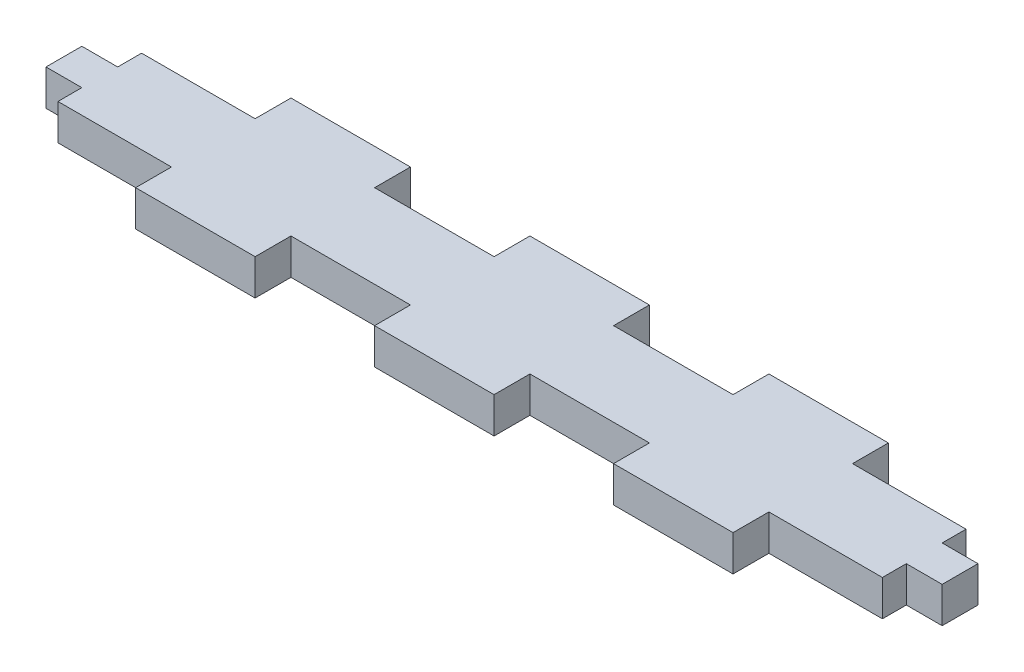
ISO-10303-21;
HEADER;
FILE_DESCRIPTION(('STEP AP214'),'2;1');
FILE_NAME('part.step','',(''),(''),'','','');
FILE_SCHEMA(('AUTOMOTIVE_DESIGN { 1 0 10303 214 1 1 1 1 }'));
ENDSEC;
DATA;
#1=APPLICATION_CONTEXT('core data for automotive mechanical design processes');
#2=APPLICATION_PROTOCOL_DEFINITION('international standard','automotive_design',2000,#1);
#3=PRODUCT_CONTEXT('',#1,'mechanical');
#4=PRODUCT('Part','Part','',(#3));
#5=PRODUCT_RELATED_PRODUCT_CATEGORY('part','',(#4));
#6=PRODUCT_DEFINITION_FORMATION('','',#4);
#7=PRODUCT_DEFINITION_CONTEXT('part definition',#1,'design');
#8=PRODUCT_DEFINITION('design','',#6,#7);
#9=PRODUCT_DEFINITION_SHAPE('','',#8);
#10=(LENGTH_UNIT() NAMED_UNIT(*) SI_UNIT(.MILLI.,.METRE.));
#11=(NAMED_UNIT(*) PLANE_ANGLE_UNIT() SI_UNIT($,.RADIAN.));
#12=(NAMED_UNIT(*) SI_UNIT($,.STERADIAN.) SOLID_ANGLE_UNIT());
#13=UNCERTAINTY_MEASURE_WITH_UNIT(LENGTH_MEASURE(1.E-05),#10,'distance_accuracy_value','');
#14=(GEOMETRIC_REPRESENTATION_CONTEXT(3) GLOBAL_UNCERTAINTY_ASSIGNED_CONTEXT((#13)) GLOBAL_UNIT_ASSIGNED_CONTEXT((#10,
#11,#12)) REPRESENTATION_CONTEXT('',''));
#15=CARTESIAN_POINT('',(0.,0.,0.));
#16=DIRECTION('',(0.,0.,1.));
#17=DIRECTION('',(1.,0.,0.));
#18=AXIS2_PLACEMENT_3D('',#15,#16,#17);
#19=CARTESIAN_POINT('',(42.5,3.,0.));
#20=DIRECTION('',(1.,0.,0.));
#21=DIRECTION('',(0.,0.,-1.));
#22=AXIS2_PLACEMENT_3D('',#19,#20,#21);
#23=PLANE('',#22);
#24=DIRECTION('',(0.,0.,1.));
#25=VECTOR('',#24,1.);
#26=CARTESIAN_POINT('',(42.5,0.,0.));
#27=LINE('',#26,#25);
#28=CARTESIAN_POINT('',(42.5,0.,-13.));
#29=VERTEX_POINT('',#28);
#30=CARTESIAN_POINT('',(42.5,0.,-9.99999999999997));
#31=VERTEX_POINT('',#30);
#32=EDGE_CURVE('E295',#29,#31,#27,.T.);
#33=ORIENTED_EDGE('',*,*,#32,.F.);
#34=DIRECTION('',(0.,-1.,0.));
#35=VECTOR('',#34,1.);
#36=CARTESIAN_POINT('',(42.5,3.,-13.));
#37=LINE('',#36,#35);
#38=CARTESIAN_POINT('',(42.5,3.,-13.));
#39=VERTEX_POINT('',#38);
#40=EDGE_CURVE('E11',#39,#29,#37,.T.);
#41=ORIENTED_EDGE('',*,*,#40,.F.);
#42=DIRECTION('',(0.,0.,1.));
#43=VECTOR('',#42,1.);
#44=CARTESIAN_POINT('',(42.5,3.,0.));
#45=LINE('',#44,#43);
#46=CARTESIAN_POINT('',(42.5,3.,-9.99999999999997));
#47=VERTEX_POINT('',#46);
#48=EDGE_CURVE('E383',#39,#47,#45,.T.);
#49=ORIENTED_EDGE('',*,*,#48,.T.);
#50=DIRECTION('',(0.,-1.,0.));
#51=VECTOR('',#50,1.);
#52=CARTESIAN_POINT('',(42.5,3.,-9.99999999999997));
#53=LINE('',#52,#51);
#54=EDGE_CURVE('E49',#47,#31,#53,.T.);
#55=ORIENTED_EDGE('',*,*,#54,.T.);
#56=EDGE_LOOP('',(#33,#41,#49,#55));
#57=FACE_BOUND('',#56,.T.);
#58=ADVANCED_FACE('F33',(#57),#23,.T.);
#59=CARTESIAN_POINT('',(0.,3.,-13.));
#60=DIRECTION('',(0.,0.,1.));
#61=DIRECTION('',(1.,0.,0.));
#62=AXIS2_PLACEMENT_3D('',#59,#60,#61);
#63=PLANE('',#62);
#64=DIRECTION('',(-1.,0.,0.));
#65=VECTOR('',#64,1.);
#66=CARTESIAN_POINT('',(0.,0.,-13.));
#67=LINE('',#66,#65);
#68=CARTESIAN_POINT('',(32.5,0.,-13.));
#69=VERTEX_POINT('',#68);
#70=EDGE_CURVE('E297',#29,#69,#67,.T.);
#71=ORIENTED_EDGE('',*,*,#70,.T.);
#72=DIRECTION('',(0.,-1.,0.));
#73=VECTOR('',#72,1.);
#74=CARTESIAN_POINT('',(32.5,3.,-13.));
#75=LINE('',#74,#73);
#76=CARTESIAN_POINT('',(32.5,3.,-13.));
#77=VERTEX_POINT('',#76);
#78=EDGE_CURVE('E41',#77,#69,#75,.T.);
#79=ORIENTED_EDGE('',*,*,#78,.F.);
#80=DIRECTION('',(-1.,0.,0.));
#81=VECTOR('',#80,1.);
#82=CARTESIAN_POINT('',(0.,3.,-13.));
#83=LINE('',#82,#81);
#84=EDGE_CURVE('E995',#39,#77,#83,.T.);
#85=ORIENTED_EDGE('',*,*,#84,.F.);
#86=ORIENTED_EDGE('',*,*,#40,.T.);
#87=EDGE_LOOP('',(#71,#79,#85,#86));
#88=FACE_BOUND('',#87,.T.);
#89=ADVANCED_FACE('F569',(#88),#63,.F.);
#90=CARTESIAN_POINT('',(32.5,3.,0.));
#91=DIRECTION('',(1.,0.,0.));
#92=DIRECTION('',(0.,0.,-1.));
#93=AXIS2_PLACEMENT_3D('',#90,#91,#92);
#94=PLANE('',#93);
#95=DIRECTION('',(0.,0.,1.));
#96=VECTOR('',#95,1.);
#97=CARTESIAN_POINT('',(32.5,0.,0.));
#98=LINE('',#97,#96);
#99=CARTESIAN_POINT('',(32.5,0.,-9.99999999999997));
#100=VERTEX_POINT('',#99);
#101=EDGE_CURVE('E299',#69,#100,#98,.T.);
#102=ORIENTED_EDGE('',*,*,#101,.T.);
#103=DIRECTION('',(0.,-1.,0.));
#104=VECTOR('',#103,1.);
#105=CARTESIAN_POINT('',(32.5,3.,-9.99999999999997));
#106=LINE('',#105,#104);
#107=CARTESIAN_POINT('',(32.5,3.,-9.99999999999997));
#108=VERTEX_POINT('',#107);
#109=EDGE_CURVE('E459',#108,#100,#106,.T.);
#110=ORIENTED_EDGE('',*,*,#109,.F.);
#111=DIRECTION('',(0.,0.,1.));
#112=VECTOR('',#111,1.);
#113=CARTESIAN_POINT('',(32.5,3.,0.));
#114=LINE('',#113,#112);
#115=EDGE_CURVE('E468',#77,#108,#114,.T.);
#116=ORIENTED_EDGE('',*,*,#115,.F.);
#117=ORIENTED_EDGE('',*,*,#78,.T.);
#118=EDGE_LOOP('',(#102,#110,#116,#117));
#119=FACE_BOUND('',#118,.T.);
#120=ADVANCED_FACE('F466',(#119),#94,.F.);
#121=CARTESIAN_POINT('',(0.,3.,-9.99999999999996));
#122=DIRECTION('',(0.,0.,1.));
#123=DIRECTION('',(1.,0.,0.));
#124=AXIS2_PLACEMENT_3D('',#121,#122,#123);
#125=PLANE('',#124);
#126=DIRECTION('',(-1.,0.,0.));
#127=VECTOR('',#126,1.);
#128=CARTESIAN_POINT('',(0.,0.,-9.99999999999996));
#129=LINE('',#128,#127);
#130=CARTESIAN_POINT('',(22.5,0.,-9.99999999999997));
#131=VERTEX_POINT('',#130);
#132=EDGE_CURVE('E301',#100,#131,#129,.T.);
#133=ORIENTED_EDGE('',*,*,#132,.T.);
#134=DIRECTION('',(0.,-1.,0.));
#135=VECTOR('',#134,1.);
#136=CARTESIAN_POINT('',(22.5,3.,-9.99999999999997));
#137=LINE('',#136,#135);
#138=CARTESIAN_POINT('',(22.5,3.,-9.99999999999997));
#139=VERTEX_POINT('',#138);
#140=EDGE_CURVE('E456',#139,#131,#137,.T.);
#141=ORIENTED_EDGE('',*,*,#140,.F.);
#142=DIRECTION('',(-1.,0.,0.));
#143=VECTOR('',#142,1.);
#144=CARTESIAN_POINT('',(0.,3.,-9.99999999999996));
#145=LINE('',#144,#143);
#146=EDGE_CURVE('E487',#108,#139,#145,.T.);
#147=ORIENTED_EDGE('',*,*,#146,.F.);
#148=ORIENTED_EDGE('',*,*,#109,.T.);
#149=EDGE_LOOP('',(#133,#141,#147,#148));
#150=FACE_BOUND('',#149,.T.);
#151=ADVANCED_FACE('F478',(#150),#125,.F.);
#152=CARTESIAN_POINT('',(22.5,3.,0.));
#153=DIRECTION('',(-1.,0.,0.));
#154=DIRECTION('',(0.,0.,1.));
#155=AXIS2_PLACEMENT_3D('',#152,#153,#154);
#156=PLANE('',#155);
#157=DIRECTION('',(0.,0.,-1.));
#158=VECTOR('',#157,1.);
#159=CARTESIAN_POINT('',(22.5,0.,0.));
#160=LINE('',#159,#158);
#161=CARTESIAN_POINT('',(22.5,0.,-13.));
#162=VERTEX_POINT('',#161);
#163=EDGE_CURVE('E303',#131,#162,#160,.T.);
#164=ORIENTED_EDGE('',*,*,#163,.T.);
#165=DIRECTION('',(0.,-1.,0.));
#166=VECTOR('',#165,1.);
#167=CARTESIAN_POINT('',(22.5,3.,-13.));
#168=LINE('',#167,#166);
#169=CARTESIAN_POINT('',(22.5,3.,-13.));
#170=VERTEX_POINT('',#169);
#171=EDGE_CURVE('E453',#170,#162,#168,.T.);
#172=ORIENTED_EDGE('',*,*,#171,.F.);
#173=DIRECTION('',(0.,0.,-1.));
#174=VECTOR('',#173,1.);
#175=CARTESIAN_POINT('',(22.5,3.,0.));
#176=LINE('',#175,#174);
#177=EDGE_CURVE('E484',#139,#170,#176,.T.);
#178=ORIENTED_EDGE('',*,*,#177,.F.);
#179=ORIENTED_EDGE('',*,*,#140,.T.);
#180=EDGE_LOOP('',(#164,#172,#178,#179));
#181=FACE_BOUND('',#180,.T.);
#182=ADVANCED_FACE('F482',(#181),#156,.F.);
#183=CARTESIAN_POINT('',(0.,3.,-13.));
#184=DIRECTION('',(0.,0.,1.));
#185=DIRECTION('',(1.,0.,0.));
#186=AXIS2_PLACEMENT_3D('',#183,#184,#185);
#187=PLANE('',#186);
#188=DIRECTION('',(-1.,0.,0.));
#189=VECTOR('',#188,1.);
#190=CARTESIAN_POINT('',(0.,0.,-13.));
#191=LINE('',#190,#189);
#192=CARTESIAN_POINT('',(12.5,0.,-13.));
#193=VERTEX_POINT('',#192);
#194=EDGE_CURVE('E305',#162,#193,#191,.T.);
#195=ORIENTED_EDGE('',*,*,#194,.T.);
#196=DIRECTION('',(0.,-1.,0.));
#197=VECTOR('',#196,1.);
#198=CARTESIAN_POINT('',(12.5,3.,-13.));
#199=LINE('',#198,#197);
#200=CARTESIAN_POINT('',(12.5,3.,-13.));
#201=VERTEX_POINT('',#200);
#202=EDGE_CURVE('E450',#201,#193,#199,.T.);
#203=ORIENTED_EDGE('',*,*,#202,.F.);
#204=DIRECTION('',(-1.,0.,0.));
#205=VECTOR('',#204,1.);
#206=CARTESIAN_POINT('',(0.,3.,-13.));
#207=LINE('',#206,#205);
#208=EDGE_CURVE('E486',#170,#201,#207,.T.);
#209=ORIENTED_EDGE('',*,*,#208,.F.);
#210=ORIENTED_EDGE('',*,*,#171,.T.);
#211=EDGE_LOOP('',(#195,#203,#209,#210));
#212=FACE_BOUND('',#211,.T.);
#213=ADVANCED_FACE('F582',(#212),#187,.F.);
#214=CARTESIAN_POINT('',(12.5,3.,0.));
#215=DIRECTION('',(1.,0.,0.));
#216=DIRECTION('',(0.,0.,-1.));
#217=AXIS2_PLACEMENT_3D('',#214,#215,#216);
#218=PLANE('',#217);
#219=DIRECTION('',(0.,0.,1.));
#220=VECTOR('',#219,1.);
#221=CARTESIAN_POINT('',(12.5,0.,0.));
#222=LINE('',#221,#220);
#223=CARTESIAN_POINT('',(12.5,0.,-9.99999999999997));
#224=VERTEX_POINT('',#223);
#225=EDGE_CURVE('E307',#193,#224,#222,.T.);
#226=ORIENTED_EDGE('',*,*,#225,.T.);
#227=DIRECTION('',(0.,-1.,0.));
#228=VECTOR('',#227,1.);
#229=CARTESIAN_POINT('',(12.5,3.,-9.99999999999997));
#230=LINE('',#229,#228);
#231=CARTESIAN_POINT('',(12.5,3.,-9.99999999999997));
#232=VERTEX_POINT('',#231);
#233=EDGE_CURVE('E447',#232,#224,#230,.T.);
#234=ORIENTED_EDGE('',*,*,#233,.F.);
#235=DIRECTION('',(0.,0.,1.));
#236=VECTOR('',#235,1.);
#237=CARTESIAN_POINT('',(12.5,3.,0.));
#238=LINE('',#237,#236);
#239=EDGE_CURVE('E489',#201,#232,#238,.T.);
#240=ORIENTED_EDGE('',*,*,#239,.F.);
#241=ORIENTED_EDGE('',*,*,#202,.T.);
#242=EDGE_LOOP('',(#226,#234,#240,#241));
#243=FACE_BOUND('',#242,.T.);
#244=ADVANCED_FACE('F585',(#243),#218,.F.);
#245=CARTESIAN_POINT('',(0.,3.,-9.99999999999997));
#246=DIRECTION('',(0.,0.,1.));
#247=DIRECTION('',(1.,0.,0.));
#248=AXIS2_PLACEMENT_3D('',#245,#246,#247);
#249=PLANE('',#248);
#250=DIRECTION('',(-1.,0.,0.));
#251=VECTOR('',#250,1.);
#252=CARTESIAN_POINT('',(0.,0.,-9.99999999999997));
#253=LINE('',#252,#251);
#254=CARTESIAN_POINT('',(3.,0.,-9.99999999999997));
#255=VERTEX_POINT('',#254);
#256=EDGE_CURVE('E309',#224,#255,#253,.T.);
#257=ORIENTED_EDGE('',*,*,#256,.T.);
#258=DIRECTION('',(0.,-1.,0.));
#259=VECTOR('',#258,1.);
#260=CARTESIAN_POINT('',(3.,3.,-9.99999999999997));
#261=LINE('',#260,#259);
#262=CARTESIAN_POINT('',(3.,3.,-9.99999999999997));
#263=VERTEX_POINT('',#262);
#264=EDGE_CURVE('E445',#263,#255,#261,.T.);
#265=ORIENTED_EDGE('',*,*,#264,.F.);
#266=DIRECTION('',(-1.,0.,0.));
#267=VECTOR('',#266,1.);
#268=CARTESIAN_POINT('',(0.,3.,-9.99999999999997));
#269=LINE('',#268,#267);
#270=EDGE_CURVE('E495',#232,#263,#269,.T.);
#271=ORIENTED_EDGE('',*,*,#270,.F.);
#272=ORIENTED_EDGE('',*,*,#233,.T.);
#273=EDGE_LOOP('',(#257,#265,#271,#272));
#274=FACE_BOUND('',#273,.T.);
#275=ADVANCED_FACE('F589',(#274),#249,.F.);
#276=CARTESIAN_POINT('',(3.,3.,0.));
#277=DIRECTION('',(-1.,0.,0.));
#278=DIRECTION('',(0.,0.,1.));
#279=AXIS2_PLACEMENT_3D('',#276,#277,#278);
#280=PLANE('',#279);
#281=DIRECTION('',(0.,0.,-1.));
#282=VECTOR('',#281,1.);
#283=CARTESIAN_POINT('',(3.,0.,0.));
#284=LINE('',#283,#282);
#285=CARTESIAN_POINT('',(3.,0.,-7.99999999999999));
#286=VERTEX_POINT('',#285);
#287=EDGE_CURVE('E312',#286,#255,#284,.T.);
#288=ORIENTED_EDGE('',*,*,#287,.F.);
#289=DIRECTION('',(0.,-1.,0.));
#290=VECTOR('',#289,1.);
#291=CARTESIAN_POINT('',(3.,3.,-7.99999999999999));
#292=LINE('',#291,#290);
#293=CARTESIAN_POINT('',(3.,3.,-7.99999999999999));
#294=VERTEX_POINT('',#293);
#295=EDGE_CURVE('E443',#294,#286,#292,.T.);
#296=ORIENTED_EDGE('',*,*,#295,.F.);
#297=DIRECTION('',(0.,0.,-1.));
#298=VECTOR('',#297,1.);
#299=CARTESIAN_POINT('',(3.,3.,0.));
#300=LINE('',#299,#298);
#301=EDGE_CURVE('E497',#294,#263,#300,.T.);
#302=ORIENTED_EDGE('',*,*,#301,.T.);
#303=ORIENTED_EDGE('',*,*,#264,.T.);
#304=EDGE_LOOP('',(#288,#296,#302,#303));
#305=FACE_BOUND('',#304,.T.);
#306=ADVANCED_FACE('F593',(#305),#280,.T.);
#307=CARTESIAN_POINT('',(0.,3.,-7.99999999999999));
#308=DIRECTION('',(0.,0.,-1.));
#309=DIRECTION('',(-1.,0.,0.));
#310=AXIS2_PLACEMENT_3D('',#307,#308,#309);
#311=PLANE('',#310);
#312=DIRECTION('',(1.,0.,0.));
#313=VECTOR('',#312,1.);
#314=CARTESIAN_POINT('',(0.,0.,-7.99999999999999));
#315=LINE('',#314,#313);
#316=CARTESIAN_POINT('',(0.,0.,-7.99999999999999));
#317=VERTEX_POINT('',#316);
#318=EDGE_CURVE('E315',#317,#286,#315,.T.);
#319=ORIENTED_EDGE('',*,*,#318,.F.);
#320=DIRECTION('',(0.,-1.,0.));
#321=VECTOR('',#320,1.);
#322=CARTESIAN_POINT('',(0.,3.,-7.99999999999999));
#323=LINE('',#322,#321);
#324=CARTESIAN_POINT('',(0.,3.,-7.99999999999999));
#325=VERTEX_POINT('',#324);
#326=EDGE_CURVE('E441',#325,#317,#323,.T.);
#327=ORIENTED_EDGE('',*,*,#326,.F.);
#328=DIRECTION('',(1.,0.,0.));
#329=VECTOR('',#328,1.);
#330=CARTESIAN_POINT('',(0.,3.,-7.99999999999999));
#331=LINE('',#330,#329);
#332=EDGE_CURVE('E500',#325,#294,#331,.T.);
#333=ORIENTED_EDGE('',*,*,#332,.T.);
#334=ORIENTED_EDGE('',*,*,#295,.T.);
#335=EDGE_LOOP('',(#319,#327,#333,#334));
#336=FACE_BOUND('',#335,.T.);
#337=ADVANCED_FACE('F597',(#336),#311,.T.);
#338=CARTESIAN_POINT('',(0.,3.,0.));
#339=DIRECTION('',(1.,0.,0.));
#340=DIRECTION('',(0.,0.,-1.));
#341=AXIS2_PLACEMENT_3D('',#338,#339,#340);
#342=PLANE('',#341);
#343=DIRECTION('',(0.,0.,1.));
#344=VECTOR('',#343,1.);
#345=CARTESIAN_POINT('',(0.,0.,0.));
#346=LINE('',#345,#344);
#347=CARTESIAN_POINT('',(0.,0.,-5.));
#348=VERTEX_POINT('',#347);
#349=EDGE_CURVE('E318',#317,#348,#346,.T.);
#350=ORIENTED_EDGE('',*,*,#349,.T.);
#351=DIRECTION('',(0.,-1.,0.));
#352=VECTOR('',#351,1.);
#353=CARTESIAN_POINT('',(0.,3.,-5.));
#354=LINE('',#353,#352);
#355=CARTESIAN_POINT('',(0.,3.,-5.));
#356=VERTEX_POINT('',#355);
#357=EDGE_CURVE('E438',#356,#348,#354,.T.);
#358=ORIENTED_EDGE('',*,*,#357,.F.);
#359=DIRECTION('',(0.,0.,1.));
#360=VECTOR('',#359,1.);
#361=CARTESIAN_POINT('',(0.,3.,0.));
#362=LINE('',#361,#360);
#363=EDGE_CURVE('E503',#325,#356,#362,.T.);
#364=ORIENTED_EDGE('',*,*,#363,.F.);
#365=ORIENTED_EDGE('',*,*,#326,.T.);
#366=EDGE_LOOP('',(#350,#358,#364,#365));
#367=FACE_BOUND('',#366,.T.);
#368=ADVANCED_FACE('F601',(#367),#342,.F.);
#369=CARTESIAN_POINT('',(0.,3.,-5.));
#370=DIRECTION('',(0.,0.,-1.));
#371=DIRECTION('',(-1.,0.,0.));
#372=AXIS2_PLACEMENT_3D('',#369,#370,#371);
#373=PLANE('',#372);
#374=DIRECTION('',(1.,0.,0.));
#375=VECTOR('',#374,1.);
#376=CARTESIAN_POINT('',(0.,0.,-5.));
#377=LINE('',#376,#375);
#378=CARTESIAN_POINT('',(3.,0.,-5.));
#379=VERTEX_POINT('',#378);
#380=EDGE_CURVE('E320',#348,#379,#377,.T.);
#381=ORIENTED_EDGE('',*,*,#380,.T.);
#382=DIRECTION('',(0.,-1.,0.));
#383=VECTOR('',#382,1.);
#384=CARTESIAN_POINT('',(3.,3.,-5.));
#385=LINE('',#384,#383);
#386=CARTESIAN_POINT('',(3.,3.,-5.));
#387=VERTEX_POINT('',#386);
#388=EDGE_CURVE('E435',#387,#379,#385,.T.);
#389=ORIENTED_EDGE('',*,*,#388,.F.);
#390=DIRECTION('',(1.,0.,0.));
#391=VECTOR('',#390,1.);
#392=CARTESIAN_POINT('',(0.,3.,-5.));
#393=LINE('',#392,#391);
#394=EDGE_CURVE('E505',#356,#387,#393,.T.);
#395=ORIENTED_EDGE('',*,*,#394,.F.);
#396=ORIENTED_EDGE('',*,*,#357,.T.);
#397=EDGE_LOOP('',(#381,#389,#395,#396));
#398=FACE_BOUND('',#397,.T.);
#399=ADVANCED_FACE('F605',(#398),#373,.F.);
#400=CARTESIAN_POINT('',(3.,3.,0.));
#401=DIRECTION('',(1.,0.,0.));
#402=DIRECTION('',(0.,0.,-1.));
#403=AXIS2_PLACEMENT_3D('',#400,#401,#402);
#404=PLANE('',#403);
#405=DIRECTION('',(0.,0.,1.));
#406=VECTOR('',#405,1.);
#407=CARTESIAN_POINT('',(3.,0.,0.));
#408=LINE('',#407,#406);
#409=CARTESIAN_POINT('',(3.,0.,-3.00000000000004));
#410=VERTEX_POINT('',#409);
#411=EDGE_CURVE('E322',#379,#410,#408,.T.);
#412=ORIENTED_EDGE('',*,*,#411,.T.);
#413=DIRECTION('',(0.,-1.,0.));
#414=VECTOR('',#413,1.);
#415=CARTESIAN_POINT('',(3.,3.,-3.00000000000004));
#416=LINE('',#415,#414);
#417=CARTESIAN_POINT('',(3.,3.,-3.00000000000004));
#418=VERTEX_POINT('',#417);
#419=EDGE_CURVE('E433',#418,#410,#416,.T.);
#420=ORIENTED_EDGE('',*,*,#419,.F.);
#421=DIRECTION('',(0.,0.,1.));
#422=VECTOR('',#421,1.);
#423=CARTESIAN_POINT('',(3.,3.,0.));
#424=LINE('',#423,#422);
#425=EDGE_CURVE('E507',#387,#418,#424,.T.);
#426=ORIENTED_EDGE('',*,*,#425,.F.);
#427=ORIENTED_EDGE('',*,*,#388,.T.);
#428=EDGE_LOOP('',(#412,#420,#426,#427));
#429=FACE_BOUND('',#428,.T.);
#430=ADVANCED_FACE('F609',(#429),#404,.F.);
#431=CARTESIAN_POINT('',(0.,3.,-3.00000000000004));
#432=DIRECTION('',(0.,0.,1.));
#433=DIRECTION('',(1.,0.,0.));
#434=AXIS2_PLACEMENT_3D('',#431,#432,#433);
#435=PLANE('',#434);
#436=DIRECTION('',(-1.,0.,0.));
#437=VECTOR('',#436,1.);
#438=CARTESIAN_POINT('',(0.,0.,-3.00000000000004));
#439=LINE('',#438,#437);
#440=CARTESIAN_POINT('',(12.5,0.,-3.00000000000004));
#441=VERTEX_POINT('',#440);
#442=EDGE_CURVE('E325',#441,#410,#439,.T.);
#443=ORIENTED_EDGE('',*,*,#442,.F.);
#444=DIRECTION('',(0.,-1.,0.));
#445=VECTOR('',#444,1.);
#446=CARTESIAN_POINT('',(12.5,3.,-3.00000000000004));
#447=LINE('',#446,#445);
#448=CARTESIAN_POINT('',(12.5,3.,-3.00000000000004));
#449=VERTEX_POINT('',#448);
#450=EDGE_CURVE('E431',#449,#441,#447,.T.);
#451=ORIENTED_EDGE('',*,*,#450,.F.);
#452=DIRECTION('',(-1.,0.,0.));
#453=VECTOR('',#452,1.);
#454=CARTESIAN_POINT('',(0.,3.,-3.00000000000004));
#455=LINE('',#454,#453);
#456=EDGE_CURVE('E509',#449,#418,#455,.T.);
#457=ORIENTED_EDGE('',*,*,#456,.T.);
#458=ORIENTED_EDGE('',*,*,#419,.T.);
#459=EDGE_LOOP('',(#443,#451,#457,#458));
#460=FACE_BOUND('',#459,.T.);
#461=ADVANCED_FACE('F613',(#460),#435,.T.);
#462=CARTESIAN_POINT('',(12.5,3.,0.));
#463=DIRECTION('',(-1.,0.,0.));
#464=DIRECTION('',(0.,0.,1.));
#465=AXIS2_PLACEMENT_3D('',#462,#463,#464);
#466=PLANE('',#465);
#467=DIRECTION('',(0.,0.,-1.));
#468=VECTOR('',#467,1.);
#469=CARTESIAN_POINT('',(12.5,0.,0.));
#470=LINE('',#469,#468);
#471=CARTESIAN_POINT('',(12.5,0.,0.));
#472=VERTEX_POINT('',#471);
#473=EDGE_CURVE('E328',#472,#441,#470,.T.);
#474=ORIENTED_EDGE('',*,*,#473,.F.);
#475=DIRECTION('',(0.,-1.,0.));
#476=VECTOR('',#475,1.);
#477=CARTESIAN_POINT('',(12.5,3.,0.));
#478=LINE('',#477,#476);
#479=CARTESIAN_POINT('',(12.5,3.,0.));
#480=VERTEX_POINT('',#479);
#481=EDGE_CURVE('E429',#480,#472,#478,.T.);
#482=ORIENTED_EDGE('',*,*,#481,.F.);
#483=DIRECTION('',(0.,0.,-1.));
#484=VECTOR('',#483,1.);
#485=CARTESIAN_POINT('',(12.5,3.,0.));
#486=LINE('',#485,#484);
#487=EDGE_CURVE('E512',#480,#449,#486,.T.);
#488=ORIENTED_EDGE('',*,*,#487,.T.);
#489=ORIENTED_EDGE('',*,*,#450,.T.);
#490=EDGE_LOOP('',(#474,#482,#488,#489));
#491=FACE_BOUND('',#490,.T.);
#492=ADVANCED_FACE('F617',(#491),#466,.T.);
#493=CARTESIAN_POINT('',(0.,3.,0.));
#494=DIRECTION('',(0.,0.,-1.));
#495=DIRECTION('',(-1.,0.,0.));
#496=AXIS2_PLACEMENT_3D('',#493,#494,#495);
#497=PLANE('',#496);
#498=DIRECTION('',(1.,0.,0.));
#499=VECTOR('',#498,1.);
#500=CARTESIAN_POINT('',(0.,0.,0.));
#501=LINE('',#500,#499);
#502=CARTESIAN_POINT('',(22.5,0.,0.));
#503=VERTEX_POINT('',#502);
#504=EDGE_CURVE('E331',#472,#503,#501,.T.);
#505=ORIENTED_EDGE('',*,*,#504,.T.);
#506=DIRECTION('',(0.,-1.,0.));
#507=VECTOR('',#506,1.);
#508=CARTESIAN_POINT('',(22.5,3.,0.));
#509=LINE('',#508,#507);
#510=CARTESIAN_POINT('',(22.5,3.,0.));
#511=VERTEX_POINT('',#510);
#512=EDGE_CURVE('E427',#511,#503,#509,.T.);
#513=ORIENTED_EDGE('',*,*,#512,.F.);
#514=DIRECTION('',(1.,0.,0.));
#515=VECTOR('',#514,1.);
#516=CARTESIAN_POINT('',(0.,3.,0.));
#517=LINE('',#516,#515);
#518=EDGE_CURVE('E515',#480,#511,#517,.T.);
#519=ORIENTED_EDGE('',*,*,#518,.F.);
#520=ORIENTED_EDGE('',*,*,#481,.T.);
#521=EDGE_LOOP('',(#505,#513,#519,#520));
#522=FACE_BOUND('',#521,.T.);
#523=ADVANCED_FACE('F621',(#522),#497,.F.);
#524=CARTESIAN_POINT('',(22.5,3.,0.));
#525=DIRECTION('',(1.,0.,0.));
#526=DIRECTION('',(0.,0.,-1.));
#527=AXIS2_PLACEMENT_3D('',#524,#525,#526);
#528=PLANE('',#527);
#529=DIRECTION('',(0.,0.,1.));
#530=VECTOR('',#529,1.);
#531=CARTESIAN_POINT('',(22.5,0.,0.));
#532=LINE('',#531,#530);
#533=CARTESIAN_POINT('',(22.5,0.,-3.00000000000004));
#534=VERTEX_POINT('',#533);
#535=EDGE_CURVE('E334',#534,#503,#532,.T.);
#536=ORIENTED_EDGE('',*,*,#535,.F.);
#537=DIRECTION('',(0.,-1.,0.));
#538=VECTOR('',#537,1.);
#539=CARTESIAN_POINT('',(22.5,3.,-3.00000000000004));
#540=LINE('',#539,#538);
#541=CARTESIAN_POINT('',(22.5,3.,-3.00000000000004));
#542=VERTEX_POINT('',#541);
#543=EDGE_CURVE('E425',#542,#534,#540,.T.);
#544=ORIENTED_EDGE('',*,*,#543,.F.);
#545=DIRECTION('',(0.,0.,1.));
#546=VECTOR('',#545,1.);
#547=CARTESIAN_POINT('',(22.5,3.,0.));
#548=LINE('',#547,#546);
#549=EDGE_CURVE('E517',#542,#511,#548,.T.);
#550=ORIENTED_EDGE('',*,*,#549,.T.);
#551=ORIENTED_EDGE('',*,*,#512,.T.);
#552=EDGE_LOOP('',(#536,#544,#550,#551));
#553=FACE_BOUND('',#552,.T.);
#554=ADVANCED_FACE('F625',(#553),#528,.T.);
#555=CARTESIAN_POINT('',(0.,3.,-3.00000000000004));
#556=DIRECTION('',(0.,0.,1.));
#557=DIRECTION('',(1.,0.,0.));
#558=AXIS2_PLACEMENT_3D('',#555,#556,#557);
#559=PLANE('',#558);
#560=DIRECTION('',(-1.,0.,0.));
#561=VECTOR('',#560,1.);
#562=CARTESIAN_POINT('',(0.,0.,-3.00000000000004));
#563=LINE('',#562,#561);
#564=CARTESIAN_POINT('',(32.5,0.,-3.00000000000003));
#565=VERTEX_POINT('',#564);
#566=EDGE_CURVE('E337',#565,#534,#563,.T.);
#567=ORIENTED_EDGE('',*,*,#566,.F.);
#568=DIRECTION('',(0.,-1.,0.));
#569=VECTOR('',#568,1.);
#570=CARTESIAN_POINT('',(32.5,3.,-3.00000000000003));
#571=LINE('',#570,#569);
#572=CARTESIAN_POINT('',(32.5,3.,-3.00000000000003));
#573=VERTEX_POINT('',#572);
#574=EDGE_CURVE('E423',#573,#565,#571,.T.);
#575=ORIENTED_EDGE('',*,*,#574,.F.);
#576=DIRECTION('',(-1.,0.,0.));
#577=VECTOR('',#576,1.);
#578=CARTESIAN_POINT('',(0.,3.,-3.00000000000004));
#579=LINE('',#578,#577);
#580=EDGE_CURVE('E520',#573,#542,#579,.T.);
#581=ORIENTED_EDGE('',*,*,#580,.T.);
#582=ORIENTED_EDGE('',*,*,#543,.T.);
#583=EDGE_LOOP('',(#567,#575,#581,#582));
#584=FACE_BOUND('',#583,.T.);
#585=ADVANCED_FACE('F629',(#584),#559,.T.);
#586=CARTESIAN_POINT('',(32.5,3.,0.));
#587=DIRECTION('',(-1.,0.,0.));
#588=DIRECTION('',(0.,0.,1.));
#589=AXIS2_PLACEMENT_3D('',#586,#587,#588);
#590=PLANE('',#589);
#591=DIRECTION('',(0.,0.,-1.));
#592=VECTOR('',#591,1.);
#593=CARTESIAN_POINT('',(32.5,0.,0.));
#594=LINE('',#593,#592);
#595=CARTESIAN_POINT('',(32.5,0.,0.));
#596=VERTEX_POINT('',#595);
#597=EDGE_CURVE('E340',#596,#565,#594,.T.);
#598=ORIENTED_EDGE('',*,*,#597,.F.);
#599=DIRECTION('',(0.,-1.,0.));
#600=VECTOR('',#599,1.);
#601=CARTESIAN_POINT('',(32.5,3.,0.));
#602=LINE('',#601,#600);
#603=CARTESIAN_POINT('',(32.5,3.,0.));
#604=VERTEX_POINT('',#603);
#605=EDGE_CURVE('E421',#604,#596,#602,.T.);
#606=ORIENTED_EDGE('',*,*,#605,.F.);
#607=DIRECTION('',(0.,0.,-1.));
#608=VECTOR('',#607,1.);
#609=CARTESIAN_POINT('',(32.5,3.,0.));
#610=LINE('',#609,#608);
#611=EDGE_CURVE('E523',#604,#573,#610,.T.);
#612=ORIENTED_EDGE('',*,*,#611,.T.);
#613=ORIENTED_EDGE('',*,*,#574,.T.);
#614=EDGE_LOOP('',(#598,#606,#612,#613));
#615=FACE_BOUND('',#614,.T.);
#616=ADVANCED_FACE('F633',(#615),#590,.T.);
#617=CARTESIAN_POINT('',(0.,3.,0.));
#618=DIRECTION('',(0.,0.,-1.));
#619=DIRECTION('',(-1.,0.,0.));
#620=AXIS2_PLACEMENT_3D('',#617,#618,#619);
#621=PLANE('',#620);
#622=DIRECTION('',(1.,0.,0.));
#623=VECTOR('',#622,1.);
#624=CARTESIAN_POINT('',(0.,0.,0.));
#625=LINE('',#624,#623);
#626=CARTESIAN_POINT('',(42.5,0.,0.));
#627=VERTEX_POINT('',#626);
#628=EDGE_CURVE('E343',#596,#627,#625,.T.);
#629=ORIENTED_EDGE('',*,*,#628,.T.);
#630=DIRECTION('',(0.,-1.,0.));
#631=VECTOR('',#630,1.);
#632=CARTESIAN_POINT('',(42.5,3.,0.));
#633=LINE('',#632,#631);
#634=CARTESIAN_POINT('',(42.5,3.,0.));
#635=VERTEX_POINT('',#634);
#636=EDGE_CURVE('E418',#635,#627,#633,.T.);
#637=ORIENTED_EDGE('',*,*,#636,.F.);
#638=DIRECTION('',(1.,0.,0.));
#639=VECTOR('',#638,1.);
#640=CARTESIAN_POINT('',(0.,3.,0.));
#641=LINE('',#640,#639);
#642=EDGE_CURVE('E526',#604,#635,#641,.T.);
#643=ORIENTED_EDGE('',*,*,#642,.F.);
#644=ORIENTED_EDGE('',*,*,#605,.T.);
#645=EDGE_LOOP('',(#629,#637,#643,#644));
#646=FACE_BOUND('',#645,.T.);
#647=ADVANCED_FACE('F637',(#646),#621,.F.);
#648=CARTESIAN_POINT('',(42.5,3.,0.));
#649=DIRECTION('',(-1.,0.,0.));
#650=DIRECTION('',(0.,0.,1.));
#651=AXIS2_PLACEMENT_3D('',#648,#649,#650);
#652=PLANE('',#651);
#653=DIRECTION('',(0.,0.,-1.));
#654=VECTOR('',#653,1.);
#655=CARTESIAN_POINT('',(42.5,0.,0.));
#656=LINE('',#655,#654);
#657=CARTESIAN_POINT('',(42.5,0.,-3.00000000000003));
#658=VERTEX_POINT('',#657);
#659=EDGE_CURVE('E345',#627,#658,#656,.T.);
#660=ORIENTED_EDGE('',*,*,#659,.T.);
#661=DIRECTION('',(0.,-1.,0.));
#662=VECTOR('',#661,1.);
#663=CARTESIAN_POINT('',(42.5,3.,-3.00000000000003));
#664=LINE('',#663,#662);
#665=CARTESIAN_POINT('',(42.5,3.,-3.00000000000003));
#666=VERTEX_POINT('',#665);
#667=EDGE_CURVE('E415',#666,#658,#664,.T.);
#668=ORIENTED_EDGE('',*,*,#667,.F.);
#669=DIRECTION('',(0.,0.,-1.));
#670=VECTOR('',#669,1.);
#671=CARTESIAN_POINT('',(42.5,3.,0.));
#672=LINE('',#671,#670);
#673=EDGE_CURVE('E528',#635,#666,#672,.T.);
#674=ORIENTED_EDGE('',*,*,#673,.F.);
#675=ORIENTED_EDGE('',*,*,#636,.T.);
#676=EDGE_LOOP('',(#660,#668,#674,#675));
#677=FACE_BOUND('',#676,.T.);
#678=ADVANCED_FACE('F641',(#677),#652,.F.);
#679=CARTESIAN_POINT('',(0.,3.,-3.00000000000002));
#680=DIRECTION('',(0.,0.,-1.));
#681=DIRECTION('',(-1.,0.,0.));
#682=AXIS2_PLACEMENT_3D('',#679,#680,#681);
#683=PLANE('',#682);
#684=DIRECTION('',(1.,0.,0.));
#685=VECTOR('',#684,1.);
#686=CARTESIAN_POINT('',(0.,0.,-3.00000000000002));
#687=LINE('',#686,#685);
#688=CARTESIAN_POINT('',(52.5,0.,-3.00000000000004));
#689=VERTEX_POINT('',#688);
#690=EDGE_CURVE('E347',#658,#689,#687,.T.);
#691=ORIENTED_EDGE('',*,*,#690,.T.);
#692=DIRECTION('',(0.,-1.,0.));
#693=VECTOR('',#692,1.);
#694=CARTESIAN_POINT('',(52.5,3.,-3.00000000000004));
#695=LINE('',#694,#693);
#696=CARTESIAN_POINT('',(52.5,3.,-3.00000000000004));
#697=VERTEX_POINT('',#696);
#698=EDGE_CURVE('E412',#697,#689,#695,.T.);
#699=ORIENTED_EDGE('',*,*,#698,.F.);
#700=DIRECTION('',(1.,0.,0.));
#701=VECTOR('',#700,1.);
#702=CARTESIAN_POINT('',(0.,3.,-3.00000000000002));
#703=LINE('',#702,#701);
#704=EDGE_CURVE('E530',#666,#697,#703,.T.);
#705=ORIENTED_EDGE('',*,*,#704,.F.);
#706=ORIENTED_EDGE('',*,*,#667,.T.);
#707=EDGE_LOOP('',(#691,#699,#705,#706));
#708=FACE_BOUND('',#707,.T.);
#709=ADVANCED_FACE('F645',(#708),#683,.F.);
#710=CARTESIAN_POINT('',(52.5,3.,0.));
#711=DIRECTION('',(1.,0.,0.));
#712=DIRECTION('',(0.,0.,-1.));
#713=AXIS2_PLACEMENT_3D('',#710,#711,#712);
#714=PLANE('',#713);
#715=DIRECTION('',(0.,0.,1.));
#716=VECTOR('',#715,1.);
#717=CARTESIAN_POINT('',(52.5,0.,0.));
#718=LINE('',#717,#716);
#719=CARTESIAN_POINT('',(52.5,0.,0.));
#720=VERTEX_POINT('',#719);
#721=EDGE_CURVE('E349',#689,#720,#718,.T.);
#722=ORIENTED_EDGE('',*,*,#721,.T.);
#723=DIRECTION('',(0.,-1.,0.));
#724=VECTOR('',#723,1.);
#725=CARTESIAN_POINT('',(52.5,3.,0.));
#726=LINE('',#725,#724);
#727=CARTESIAN_POINT('',(52.5,3.,0.));
#728=VERTEX_POINT('',#727);
#729=EDGE_CURVE('E409',#728,#720,#726,.T.);
#730=ORIENTED_EDGE('',*,*,#729,.F.);
#731=DIRECTION('',(0.,0.,1.));
#732=VECTOR('',#731,1.);
#733=CARTESIAN_POINT('',(52.5,3.,0.));
#734=LINE('',#733,#732);
#735=EDGE_CURVE('E532',#697,#728,#734,.T.);
#736=ORIENTED_EDGE('',*,*,#735,.F.);
#737=ORIENTED_EDGE('',*,*,#698,.T.);
#738=EDGE_LOOP('',(#722,#730,#736,#737));
#739=FACE_BOUND('',#738,.T.);
#740=ADVANCED_FACE('F649',(#739),#714,.F.);
#741=CARTESIAN_POINT('',(0.,3.,0.));
#742=DIRECTION('',(0.,0.,-1.));
#743=DIRECTION('',(-1.,0.,0.));
#744=AXIS2_PLACEMENT_3D('',#741,#742,#743);
#745=PLANE('',#744);
#746=DIRECTION('',(1.,0.,0.));
#747=VECTOR('',#746,1.);
#748=CARTESIAN_POINT('',(0.,0.,0.));
#749=LINE('',#748,#747);
#750=CARTESIAN_POINT('',(62.5,0.,0.));
#751=VERTEX_POINT('',#750);
#752=EDGE_CURVE('E351',#720,#751,#749,.T.);
#753=ORIENTED_EDGE('',*,*,#752,.T.);
#754=DIRECTION('',(0.,-1.,0.));
#755=VECTOR('',#754,1.);
#756=CARTESIAN_POINT('',(62.5,3.,0.));
#757=LINE('',#756,#755);
#758=CARTESIAN_POINT('',(62.5,3.,0.));
#759=VERTEX_POINT('',#758);
#760=EDGE_CURVE('E406',#759,#751,#757,.T.);
#761=ORIENTED_EDGE('',*,*,#760,.F.);
#762=DIRECTION('',(1.,0.,0.));
#763=VECTOR('',#762,1.);
#764=CARTESIAN_POINT('',(0.,3.,0.));
#765=LINE('',#764,#763);
#766=EDGE_CURVE('E534',#728,#759,#765,.T.);
#767=ORIENTED_EDGE('',*,*,#766,.F.);
#768=ORIENTED_EDGE('',*,*,#729,.T.);
#769=EDGE_LOOP('',(#753,#761,#767,#768));
#770=FACE_BOUND('',#769,.T.);
#771=ADVANCED_FACE('F653',(#770),#745,.F.);
#772=CARTESIAN_POINT('',(62.5,3.,0.));
#773=DIRECTION('',(-1.,0.,0.));
#774=DIRECTION('',(0.,0.,1.));
#775=AXIS2_PLACEMENT_3D('',#772,#773,#774);
#776=PLANE('',#775);
#777=DIRECTION('',(0.,0.,-1.));
#778=VECTOR('',#777,1.);
#779=CARTESIAN_POINT('',(62.5,0.,0.));
#780=LINE('',#779,#778);
#781=CARTESIAN_POINT('',(62.5,0.,-3.00000000000004));
#782=VERTEX_POINT('',#781);
#783=EDGE_CURVE('E353',#751,#782,#780,.T.);
#784=ORIENTED_EDGE('',*,*,#783,.T.);
#785=DIRECTION('',(0.,-1.,0.));
#786=VECTOR('',#785,1.);
#787=CARTESIAN_POINT('',(62.5,3.,-3.00000000000004));
#788=LINE('',#787,#786);
#789=CARTESIAN_POINT('',(62.5,3.,-3.00000000000004));
#790=VERTEX_POINT('',#789);
#791=EDGE_CURVE('E403',#790,#782,#788,.T.);
#792=ORIENTED_EDGE('',*,*,#791,.F.);
#793=DIRECTION('',(0.,0.,-1.));
#794=VECTOR('',#793,1.);
#795=CARTESIAN_POINT('',(62.5,3.,0.));
#796=LINE('',#795,#794);
#797=EDGE_CURVE('E536',#759,#790,#796,.T.);
#798=ORIENTED_EDGE('',*,*,#797,.F.);
#799=ORIENTED_EDGE('',*,*,#760,.T.);
#800=EDGE_LOOP('',(#784,#792,#798,#799));
#801=FACE_BOUND('',#800,.T.);
#802=ADVANCED_FACE('F657',(#801),#776,.F.);
#803=CARTESIAN_POINT('',(0.,3.,-3.00000000000004));
#804=DIRECTION('',(0.,0.,-1.));
#805=DIRECTION('',(-1.,0.,0.));
#806=AXIS2_PLACEMENT_3D('',#803,#804,#805);
#807=PLANE('',#806);
#808=DIRECTION('',(1.,0.,0.));
#809=VECTOR('',#808,1.);
#810=CARTESIAN_POINT('',(0.,0.,-3.00000000000004));
#811=LINE('',#810,#809);
#812=CARTESIAN_POINT('',(72.,0.,-3.00000000000004));
#813=VERTEX_POINT('',#812);
#814=EDGE_CURVE('E355',#782,#813,#811,.T.);
#815=ORIENTED_EDGE('',*,*,#814,.T.);
#816=DIRECTION('',(0.,-1.,0.));
#817=VECTOR('',#816,1.);
#818=CARTESIAN_POINT('',(72.,3.,-3.00000000000004));
#819=LINE('',#818,#817);
#820=CARTESIAN_POINT('',(72.,3.,-3.00000000000004));
#821=VERTEX_POINT('',#820);
#822=EDGE_CURVE('E401',#821,#813,#819,.T.);
#823=ORIENTED_EDGE('',*,*,#822,.F.);
#824=DIRECTION('',(1.,0.,0.));
#825=VECTOR('',#824,1.);
#826=CARTESIAN_POINT('',(0.,3.,-3.00000000000004));
#827=LINE('',#826,#825);
#828=EDGE_CURVE('E538',#790,#821,#827,.T.);
#829=ORIENTED_EDGE('',*,*,#828,.F.);
#830=ORIENTED_EDGE('',*,*,#791,.T.);
#831=EDGE_LOOP('',(#815,#823,#829,#830));
#832=FACE_BOUND('',#831,.T.);
#833=ADVANCED_FACE('F661',(#832),#807,.F.);
#834=CARTESIAN_POINT('',(72.,3.,0.));
#835=DIRECTION('',(1.,0.,0.));
#836=DIRECTION('',(0.,0.,-1.));
#837=AXIS2_PLACEMENT_3D('',#834,#835,#836);
#838=PLANE('',#837);
#839=DIRECTION('',(0.,0.,1.));
#840=VECTOR('',#839,1.);
#841=CARTESIAN_POINT('',(72.,0.,0.));
#842=LINE('',#841,#840);
#843=CARTESIAN_POINT('',(72.,0.,-5.));
#844=VERTEX_POINT('',#843);
#845=EDGE_CURVE('E358',#844,#813,#842,.T.);
#846=ORIENTED_EDGE('',*,*,#845,.F.);
#847=DIRECTION('',(0.,-1.,0.));
#848=VECTOR('',#847,1.);
#849=CARTESIAN_POINT('',(72.,3.,-5.));
#850=LINE('',#849,#848);
#851=CARTESIAN_POINT('',(72.,3.,-5.));
#852=VERTEX_POINT('',#851);
#853=EDGE_CURVE('E399',#852,#844,#850,.T.);
#854=ORIENTED_EDGE('',*,*,#853,.F.);
#855=DIRECTION('',(0.,0.,1.));
#856=VECTOR('',#855,1.);
#857=CARTESIAN_POINT('',(72.,3.,0.));
#858=LINE('',#857,#856);
#859=EDGE_CURVE('E540',#852,#821,#858,.T.);
#860=ORIENTED_EDGE('',*,*,#859,.T.);
#861=ORIENTED_EDGE('',*,*,#822,.T.);
#862=EDGE_LOOP('',(#846,#854,#860,#861));
#863=FACE_BOUND('',#862,.T.);
#864=ADVANCED_FACE('F665',(#863),#838,.T.);
#865=CARTESIAN_POINT('',(0.,3.,-5.));
#866=DIRECTION('',(0.,0.,1.));
#867=DIRECTION('',(1.,0.,0.));
#868=AXIS2_PLACEMENT_3D('',#865,#866,#867);
#869=PLANE('',#868);
#870=DIRECTION('',(-1.,0.,0.));
#871=VECTOR('',#870,1.);
#872=CARTESIAN_POINT('',(0.,0.,-5.));
#873=LINE('',#872,#871);
#874=CARTESIAN_POINT('',(75.,0.,-5.));
#875=VERTEX_POINT('',#874);
#876=EDGE_CURVE('E361',#875,#844,#873,.T.);
#877=ORIENTED_EDGE('',*,*,#876,.F.);
#878=DIRECTION('',(0.,-1.,0.));
#879=VECTOR('',#878,1.);
#880=CARTESIAN_POINT('',(75.,3.,-5.));
#881=LINE('',#880,#879);
#882=CARTESIAN_POINT('',(75.,3.,-5.));
#883=VERTEX_POINT('',#882);
#884=EDGE_CURVE('E397',#883,#875,#881,.T.);
#885=ORIENTED_EDGE('',*,*,#884,.F.);
#886=DIRECTION('',(-1.,0.,0.));
#887=VECTOR('',#886,1.);
#888=CARTESIAN_POINT('',(0.,3.,-5.));
#889=LINE('',#888,#887);
#890=EDGE_CURVE('E543',#883,#852,#889,.T.);
#891=ORIENTED_EDGE('',*,*,#890,.T.);
#892=ORIENTED_EDGE('',*,*,#853,.T.);
#893=EDGE_LOOP('',(#877,#885,#891,#892));
#894=FACE_BOUND('',#893,.T.);
#895=ADVANCED_FACE('F669',(#894),#869,.T.);
#896=CARTESIAN_POINT('',(75.,3.,0.));
#897=DIRECTION('',(-1.,0.,0.));
#898=DIRECTION('',(0.,0.,1.));
#899=AXIS2_PLACEMENT_3D('',#896,#897,#898);
#900=PLANE('',#899);
#901=DIRECTION('',(0.,0.,-1.));
#902=VECTOR('',#901,1.);
#903=CARTESIAN_POINT('',(75.,0.,0.));
#904=LINE('',#903,#902);
#905=CARTESIAN_POINT('',(75.,0.,-7.99999999999999));
#906=VERTEX_POINT('',#905);
#907=EDGE_CURVE('E364',#875,#906,#904,.T.);
#908=ORIENTED_EDGE('',*,*,#907,.T.);
#909=DIRECTION('',(0.,-1.,0.));
#910=VECTOR('',#909,1.);
#911=CARTESIAN_POINT('',(75.,3.,-7.99999999999999));
#912=LINE('',#911,#910);
#913=CARTESIAN_POINT('',(75.,3.,-7.99999999999999));
#914=VERTEX_POINT('',#913);
#915=EDGE_CURVE('E394',#914,#906,#912,.T.);
#916=ORIENTED_EDGE('',*,*,#915,.F.);
#917=DIRECTION('',(0.,0.,-1.));
#918=VECTOR('',#917,1.);
#919=CARTESIAN_POINT('',(75.,3.,0.));
#920=LINE('',#919,#918);
#921=EDGE_CURVE('E546',#883,#914,#920,.T.);
#922=ORIENTED_EDGE('',*,*,#921,.F.);
#923=ORIENTED_EDGE('',*,*,#884,.T.);
#924=EDGE_LOOP('',(#908,#916,#922,#923));
#925=FACE_BOUND('',#924,.T.);
#926=ADVANCED_FACE('F673',(#925),#900,.F.);
#927=CARTESIAN_POINT('',(0.,3.,-7.99999999999999));
#928=DIRECTION('',(0.,0.,1.));
#929=DIRECTION('',(1.,0.,0.));
#930=AXIS2_PLACEMENT_3D('',#927,#928,#929);
#931=PLANE('',#930);
#932=DIRECTION('',(-1.,0.,0.));
#933=VECTOR('',#932,1.);
#934=CARTESIAN_POINT('',(0.,0.,-7.99999999999999));
#935=LINE('',#934,#933);
#936=CARTESIAN_POINT('',(72.,0.,-7.99999999999999));
#937=VERTEX_POINT('',#936);
#938=EDGE_CURVE('E366',#906,#937,#935,.T.);
#939=ORIENTED_EDGE('',*,*,#938,.T.);
#940=DIRECTION('',(0.,-1.,0.));
#941=VECTOR('',#940,1.);
#942=CARTESIAN_POINT('',(72.,3.,-7.99999999999999));
#943=LINE('',#942,#941);
#944=CARTESIAN_POINT('',(72.,3.,-7.99999999999999));
#945=VERTEX_POINT('',#944);
#946=EDGE_CURVE('E391',#945,#937,#943,.T.);
#947=ORIENTED_EDGE('',*,*,#946,.F.);
#948=DIRECTION('',(-1.,0.,0.));
#949=VECTOR('',#948,1.);
#950=CARTESIAN_POINT('',(0.,3.,-7.99999999999999));
#951=LINE('',#950,#949);
#952=EDGE_CURVE('E548',#914,#945,#951,.T.);
#953=ORIENTED_EDGE('',*,*,#952,.F.);
#954=ORIENTED_EDGE('',*,*,#915,.T.);
#955=EDGE_LOOP('',(#939,#947,#953,#954));
#956=FACE_BOUND('',#955,.T.);
#957=ADVANCED_FACE('F677',(#956),#931,.F.);
#958=CARTESIAN_POINT('',(72.,3.,0.));
#959=DIRECTION('',(-1.,0.,0.));
#960=DIRECTION('',(0.,0.,1.));
#961=AXIS2_PLACEMENT_3D('',#958,#959,#960);
#962=PLANE('',#961);
#963=DIRECTION('',(0.,0.,-1.));
#964=VECTOR('',#963,1.);
#965=CARTESIAN_POINT('',(72.,0.,0.));
#966=LINE('',#965,#964);
#967=CARTESIAN_POINT('',(72.,0.,-9.99999999999997));
#968=VERTEX_POINT('',#967);
#969=EDGE_CURVE('E368',#937,#968,#966,.T.);
#970=ORIENTED_EDGE('',*,*,#969,.T.);
#971=DIRECTION('',(0.,-1.,0.));
#972=VECTOR('',#971,1.);
#973=CARTESIAN_POINT('',(72.,3.,-9.99999999999997));
#974=LINE('',#973,#972);
#975=CARTESIAN_POINT('',(72.,3.,-9.99999999999997));
#976=VERTEX_POINT('',#975);
#977=EDGE_CURVE('E389',#976,#968,#974,.T.);
#978=ORIENTED_EDGE('',*,*,#977,.F.);
#979=DIRECTION('',(0.,0.,-1.));
#980=VECTOR('',#979,1.);
#981=CARTESIAN_POINT('',(72.,3.,0.));
#982=LINE('',#981,#980);
#983=EDGE_CURVE('E550',#945,#976,#982,.T.);
#984=ORIENTED_EDGE('',*,*,#983,.F.);
#985=ORIENTED_EDGE('',*,*,#946,.T.);
#986=EDGE_LOOP('',(#970,#978,#984,#985));
#987=FACE_BOUND('',#986,.T.);
#988=ADVANCED_FACE('F681',(#987),#962,.F.);
#989=CARTESIAN_POINT('',(0.,3.,-9.99999999999997));
#990=DIRECTION('',(0.,0.,-1.));
#991=DIRECTION('',(-1.,0.,0.));
#992=AXIS2_PLACEMENT_3D('',#989,#990,#991);
#993=PLANE('',#992);
#994=DIRECTION('',(1.,0.,0.));
#995=VECTOR('',#994,1.);
#996=CARTESIAN_POINT('',(0.,0.,-9.99999999999997));
#997=LINE('',#996,#995);
#998=CARTESIAN_POINT('',(62.5,0.,-9.99999999999997));
#999=VERTEX_POINT('',#998);
#1000=EDGE_CURVE('E371',#999,#968,#997,.T.);
#1001=ORIENTED_EDGE('',*,*,#1000,.F.);
#1002=DIRECTION('',(0.,-1.,0.));
#1003=VECTOR('',#1002,1.);
#1004=CARTESIAN_POINT('',(62.5,3.,-9.99999999999997));
#1005=LINE('',#1004,#1003);
#1006=CARTESIAN_POINT('',(62.5,3.,-9.99999999999997));
#1007=VERTEX_POINT('',#1006);
#1008=EDGE_CURVE('E387',#1007,#999,#1005,.T.);
#1009=ORIENTED_EDGE('',*,*,#1008,.F.);
#1010=DIRECTION('',(1.,0.,0.));
#1011=VECTOR('',#1010,1.);
#1012=CARTESIAN_POINT('',(0.,3.,-9.99999999999997));
#1013=LINE('',#1012,#1011);
#1014=EDGE_CURVE('E552',#1007,#976,#1013,.T.);
#1015=ORIENTED_EDGE('',*,*,#1014,.T.);
#1016=ORIENTED_EDGE('',*,*,#977,.T.);
#1017=EDGE_LOOP('',(#1001,#1009,#1015,#1016));
#1018=FACE_BOUND('',#1017,.T.);
#1019=ADVANCED_FACE('F685',(#1018),#993,.T.);
#1020=CARTESIAN_POINT('',(62.5,3.,0.));
#1021=DIRECTION('',(1.,0.,0.));
#1022=DIRECTION('',(0.,0.,-1.));
#1023=AXIS2_PLACEMENT_3D('',#1020,#1021,#1022);
#1024=PLANE('',#1023);
#1025=DIRECTION('',(0.,0.,1.));
#1026=VECTOR('',#1025,1.);
#1027=CARTESIAN_POINT('',(62.5,0.,0.));
#1028=LINE('',#1027,#1026);
#1029=CARTESIAN_POINT('',(62.5,0.,-13.));
#1030=VERTEX_POINT('',#1029);
#1031=EDGE_CURVE('E374',#1030,#999,#1028,.T.);
#1032=ORIENTED_EDGE('',*,*,#1031,.F.);
#1033=DIRECTION('',(0.,-1.,0.));
#1034=VECTOR('',#1033,1.);
#1035=CARTESIAN_POINT('',(62.5,3.,-13.));
#1036=LINE('',#1035,#1034);
#1037=CARTESIAN_POINT('',(62.5,3.,-13.));
#1038=VERTEX_POINT('',#1037);
#1039=EDGE_CURVE('E287',#1038,#1030,#1036,.T.);
#1040=ORIENTED_EDGE('',*,*,#1039,.F.);
#1041=DIRECTION('',(0.,0.,1.));
#1042=VECTOR('',#1041,1.);
#1043=CARTESIAN_POINT('',(62.5,3.,0.));
#1044=LINE('',#1043,#1042);
#1045=EDGE_CURVE('E277',#1038,#1007,#1044,.T.);
#1046=ORIENTED_EDGE('',*,*,#1045,.T.);
#1047=ORIENTED_EDGE('',*,*,#1008,.T.);
#1048=EDGE_LOOP('',(#1032,#1040,#1046,#1047));
#1049=FACE_BOUND('',#1048,.T.);
#1050=ADVANCED_FACE('F556',(#1049),#1024,.T.);
#1051=CARTESIAN_POINT('',(0.,3.,-13.));
#1052=DIRECTION('',(0.,0.,1.));
#1053=DIRECTION('',(1.,0.,0.));
#1054=AXIS2_PLACEMENT_3D('',#1051,#1052,#1053);
#1055=PLANE('',#1054);
#1056=DIRECTION('',(-1.,0.,0.));
#1057=VECTOR('',#1056,1.);
#1058=CARTESIAN_POINT('',(0.,0.,-13.));
#1059=LINE('',#1058,#1057);
#1060=CARTESIAN_POINT('',(52.5,0.,-13.));
#1061=VERTEX_POINT('',#1060);
#1062=EDGE_CURVE('E284',#1030,#1061,#1059,.T.);
#1063=ORIENTED_EDGE('',*,*,#1062,.T.);
#1064=DIRECTION('',(0.,-1.,0.));
#1065=VECTOR('',#1064,1.);
#1066=CARTESIAN_POINT('',(52.5,3.,-13.));
#1067=LINE('',#1066,#1065);
#1068=CARTESIAN_POINT('',(52.5,3.,-13.));
#1069=VERTEX_POINT('',#1068);
#1070=EDGE_CURVE('E281',#1069,#1061,#1067,.T.);
#1071=ORIENTED_EDGE('',*,*,#1070,.F.);
#1072=DIRECTION('',(-1.,0.,0.));
#1073=VECTOR('',#1072,1.);
#1074=CARTESIAN_POINT('',(0.,3.,-13.));
#1075=LINE('',#1074,#1073);
#1076=EDGE_CURVE('E268',#1038,#1069,#1075,.T.);
#1077=ORIENTED_EDGE('',*,*,#1076,.F.);
#1078=ORIENTED_EDGE('',*,*,#1039,.T.);
#1079=EDGE_LOOP('',(#1063,#1071,#1077,#1078));
#1080=FACE_BOUND('',#1079,.T.);
#1081=ADVANCED_FACE('F282',(#1080),#1055,.F.);
#1082=CARTESIAN_POINT('',(52.5,3.,0.));
#1083=DIRECTION('',(-1.,0.,0.));
#1084=DIRECTION('',(0.,0.,1.));
#1085=AXIS2_PLACEMENT_3D('',#1082,#1083,#1084);
#1086=PLANE('',#1085);
#1087=DIRECTION('',(0.,0.,-1.));
#1088=VECTOR('',#1087,1.);
#1089=CARTESIAN_POINT('',(52.5,0.,0.));
#1090=LINE('',#1089,#1088);
#1091=CARTESIAN_POINT('',(52.5,0.,-9.99999999999997));
#1092=VERTEX_POINT('',#1091);
#1093=EDGE_CURVE('E378',#1092,#1061,#1090,.T.);
#1094=ORIENTED_EDGE('',*,*,#1093,.F.);
#1095=DIRECTION('',(0.,-1.,0.));
#1096=VECTOR('',#1095,1.);
#1097=CARTESIAN_POINT('',(52.5,3.,-9.99999999999997));
#1098=LINE('',#1097,#1096);
#1099=CARTESIAN_POINT('',(52.5,3.,-9.99999999999997));
#1100=VERTEX_POINT('',#1099);
#1101=EDGE_CURVE('E158',#1100,#1092,#1098,.T.);
#1102=ORIENTED_EDGE('',*,*,#1101,.F.);
#1103=DIRECTION('',(0.,0.,-1.));
#1104=VECTOR('',#1103,1.);
#1105=CARTESIAN_POINT('',(52.5,3.,0.));
#1106=LINE('',#1105,#1104);
#1107=EDGE_CURVE('E274',#1100,#1069,#1106,.T.);
#1108=ORIENTED_EDGE('',*,*,#1107,.T.);
#1109=ORIENTED_EDGE('',*,*,#1070,.T.);
#1110=EDGE_LOOP('',(#1094,#1102,#1108,#1109));
#1111=FACE_BOUND('',#1110,.T.);
#1112=ADVANCED_FACE('F289',(#1111),#1086,.T.);
#1113=CARTESIAN_POINT('',(0.,3.,-9.99999999999998));
#1114=DIRECTION('',(0.,0.,-1.));
#1115=DIRECTION('',(-1.,0.,0.));
#1116=AXIS2_PLACEMENT_3D('',#1113,#1114,#1115);
#1117=PLANE('',#1116);
#1118=DIRECTION('',(1.,0.,0.));
#1119=VECTOR('',#1118,1.);
#1120=CARTESIAN_POINT('',(0.,0.,-9.99999999999998));
#1121=LINE('',#1120,#1119);
#1122=EDGE_CURVE('E380',#31,#1092,#1121,.T.);
#1123=ORIENTED_EDGE('',*,*,#1122,.F.);
#1124=ORIENTED_EDGE('',*,*,#54,.F.);
#1125=DIRECTION('',(1.,0.,0.));
#1126=VECTOR('',#1125,1.);
#1127=CARTESIAN_POINT('',(0.,3.,-9.99999999999998));
#1128=LINE('',#1127,#1126);
#1129=EDGE_CURVE('E290',#47,#1100,#1128,.T.);
#1130=ORIENTED_EDGE('',*,*,#1129,.T.);
#1131=ORIENTED_EDGE('',*,*,#1101,.T.);
#1132=EDGE_LOOP('',(#1123,#1124,#1130,#1131));
#1133=FACE_BOUND('',#1132,.T.);
#1134=ADVANCED_FACE('F558',(#1133),#1117,.T.);
#1135=CARTESIAN_POINT('',(0.,3.,0.));
#1136=DIRECTION('',(0.,1.,0.));
#1137=DIRECTION('',(0.,0.,1.));
#1138=AXIS2_PLACEMENT_3D('',#1135,#1136,#1137);
#1139=PLANE('',#1138);
#1140=ORIENTED_EDGE('',*,*,#48,.F.);
#1141=ORIENTED_EDGE('',*,*,#84,.T.);
#1142=ORIENTED_EDGE('',*,*,#115,.T.);
#1143=ORIENTED_EDGE('',*,*,#146,.T.);
#1144=ORIENTED_EDGE('',*,*,#177,.T.);
#1145=ORIENTED_EDGE('',*,*,#208,.T.);
#1146=ORIENTED_EDGE('',*,*,#239,.T.);
#1147=ORIENTED_EDGE('',*,*,#270,.T.);
#1148=ORIENTED_EDGE('',*,*,#301,.F.);
#1149=ORIENTED_EDGE('',*,*,#332,.F.);
#1150=ORIENTED_EDGE('',*,*,#363,.T.);
#1151=ORIENTED_EDGE('',*,*,#394,.T.);
#1152=ORIENTED_EDGE('',*,*,#425,.T.);
#1153=ORIENTED_EDGE('',*,*,#456,.F.);
#1154=ORIENTED_EDGE('',*,*,#487,.F.);
#1155=ORIENTED_EDGE('',*,*,#518,.T.);
#1156=ORIENTED_EDGE('',*,*,#549,.F.);
#1157=ORIENTED_EDGE('',*,*,#580,.F.);
#1158=ORIENTED_EDGE('',*,*,#611,.F.);
#1159=ORIENTED_EDGE('',*,*,#642,.T.);
#1160=ORIENTED_EDGE('',*,*,#673,.T.);
#1161=ORIENTED_EDGE('',*,*,#704,.T.);
#1162=ORIENTED_EDGE('',*,*,#735,.T.);
#1163=ORIENTED_EDGE('',*,*,#766,.T.);
#1164=ORIENTED_EDGE('',*,*,#797,.T.);
#1165=ORIENTED_EDGE('',*,*,#828,.T.);
#1166=ORIENTED_EDGE('',*,*,#859,.F.);
#1167=ORIENTED_EDGE('',*,*,#890,.F.);
#1168=ORIENTED_EDGE('',*,*,#921,.T.);
#1169=ORIENTED_EDGE('',*,*,#952,.T.);
#1170=ORIENTED_EDGE('',*,*,#983,.T.);
#1171=ORIENTED_EDGE('',*,*,#1014,.F.);
#1172=ORIENTED_EDGE('',*,*,#1045,.F.);
#1173=ORIENTED_EDGE('',*,*,#1076,.T.);
#1174=ORIENTED_EDGE('',*,*,#1107,.F.);
#1175=ORIENTED_EDGE('',*,*,#1129,.F.);
#1176=EDGE_LOOP('',(#1140,#1141,#1142,#1143,#1144,#1145,#1146,#1147,#1148,#1149,#1150,#1151,
#1152,#1153,#1154,#1155,#1156,#1157,#1158,#1159,#1160,#1161,#1162,#1163,#1164,#1165,#1166,#1167,
#1168,#1169,#1170,#1171,#1172,#1173,#1174,#1175));
#1177=FACE_BOUND('',#1176,.T.);
#1178=ADVANCED_FACE('F271',(#1177),#1139,.T.);
#1179=CARTESIAN_POINT('',(0.,0.,0.));
#1180=DIRECTION('',(0.,1.,0.));
#1181=DIRECTION('',(0.,0.,1.));
#1182=AXIS2_PLACEMENT_3D('',#1179,#1180,#1181);
#1183=PLANE('',#1182);
#1184=ORIENTED_EDGE('',*,*,#32,.T.);
#1185=ORIENTED_EDGE('',*,*,#1122,.T.);
#1186=ORIENTED_EDGE('',*,*,#1093,.T.);
#1187=ORIENTED_EDGE('',*,*,#1062,.F.);
#1188=ORIENTED_EDGE('',*,*,#1031,.T.);
#1189=ORIENTED_EDGE('',*,*,#1000,.T.);
#1190=ORIENTED_EDGE('',*,*,#969,.F.);
#1191=ORIENTED_EDGE('',*,*,#938,.F.);
#1192=ORIENTED_EDGE('',*,*,#907,.F.);
#1193=ORIENTED_EDGE('',*,*,#876,.T.);
#1194=ORIENTED_EDGE('',*,*,#845,.T.);
#1195=ORIENTED_EDGE('',*,*,#814,.F.);
#1196=ORIENTED_EDGE('',*,*,#783,.F.);
#1197=ORIENTED_EDGE('',*,*,#752,.F.);
#1198=ORIENTED_EDGE('',*,*,#721,.F.);
#1199=ORIENTED_EDGE('',*,*,#690,.F.);
#1200=ORIENTED_EDGE('',*,*,#659,.F.);
#1201=ORIENTED_EDGE('',*,*,#628,.F.);
#1202=ORIENTED_EDGE('',*,*,#597,.T.);
#1203=ORIENTED_EDGE('',*,*,#566,.T.);
#1204=ORIENTED_EDGE('',*,*,#535,.T.);
#1205=ORIENTED_EDGE('',*,*,#504,.F.);
#1206=ORIENTED_EDGE('',*,*,#473,.T.);
#1207=ORIENTED_EDGE('',*,*,#442,.T.);
#1208=ORIENTED_EDGE('',*,*,#411,.F.);
#1209=ORIENTED_EDGE('',*,*,#380,.F.);
#1210=ORIENTED_EDGE('',*,*,#349,.F.);
#1211=ORIENTED_EDGE('',*,*,#318,.T.);
#1212=ORIENTED_EDGE('',*,*,#287,.T.);
#1213=ORIENTED_EDGE('',*,*,#256,.F.);
#1214=ORIENTED_EDGE('',*,*,#225,.F.);
#1215=ORIENTED_EDGE('',*,*,#194,.F.);
#1216=ORIENTED_EDGE('',*,*,#163,.F.);
#1217=ORIENTED_EDGE('',*,*,#132,.F.);
#1218=ORIENTED_EDGE('',*,*,#101,.F.);
#1219=ORIENTED_EDGE('',*,*,#70,.F.);
#1220=EDGE_LOOP('',(#1184,#1185,#1186,#1187,#1188,#1189,#1190,#1191,#1192,#1193,#1194,#1195,
#1196,#1197,#1198,#1199,#1200,#1201,#1202,#1203,#1204,#1205,#1206,#1207,#1208,#1209,#1210,#1211,
#1212,#1213,#1214,#1215,#1216,#1217,#1218,#1219));
#1221=FACE_BOUND('',#1220,.T.);
#1222=ADVANCED_FACE('F473',(#1221),#1183,.F.);
#1223=CLOSED_SHELL('',(#58,#89,#120,#151,#182,#213,#244,#275,#306,#337,#368,#399,#430,#461,#492,
#523,#554,#585,#616,#647,#678,#709,#740,#771,#802,#833,#864,#895,#926,#957,#988,#1019,#1050,
#1081,#1112,#1134,#1178,#1222));
#1224=MANIFOLD_SOLID_BREP('B2',#1223);
#1225=ADVANCED_BREP_SHAPE_REPRESENTATION('',(#18,#1224),#14);
#1226=SHAPE_DEFINITION_REPRESENTATION(#9,#1225);
ENDSEC;
END-ISO-10303-21;
